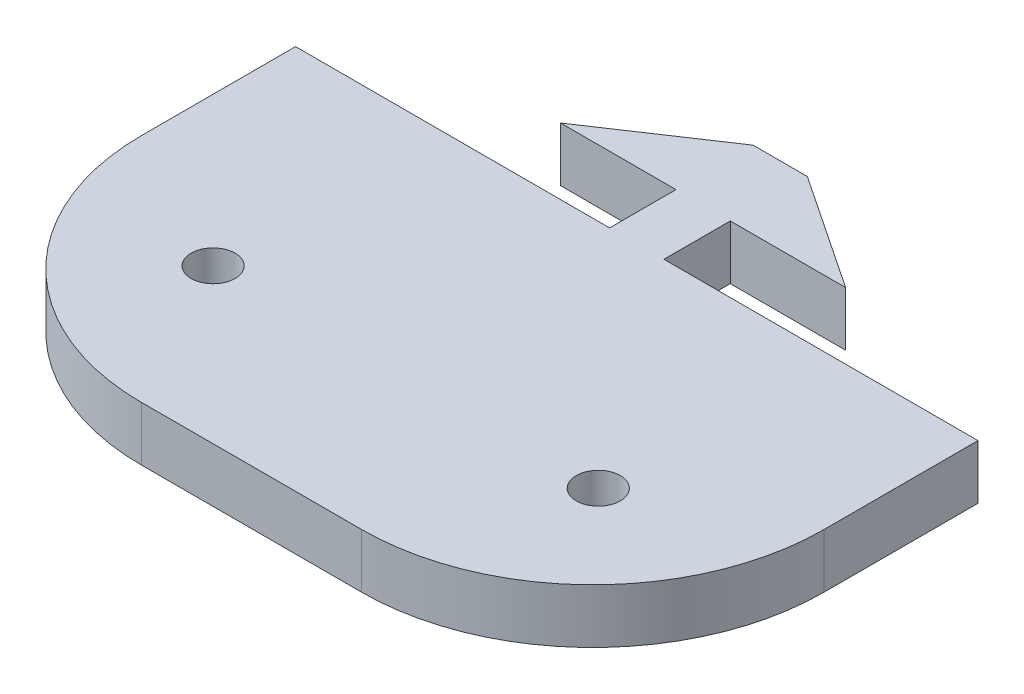
ISO-10303-21;
HEADER;
FILE_DESCRIPTION(('STEP AP214'),'2;1');
FILE_NAME('part.step','',(''),(''),'','','');
FILE_SCHEMA(('AUTOMOTIVE_DESIGN { 1 0 10303 214 1 1 1 1 }'));
ENDSEC;
DATA;
#1=APPLICATION_CONTEXT('core data for automotive mechanical design processes');
#2=APPLICATION_PROTOCOL_DEFINITION('international standard','automotive_design',2000,#1);
#3=PRODUCT_CONTEXT('',#1,'mechanical');
#4=PRODUCT('Part','Part','',(#3));
#5=PRODUCT_RELATED_PRODUCT_CATEGORY('part','',(#4));
#6=PRODUCT_DEFINITION_FORMATION('','',#4);
#7=PRODUCT_DEFINITION_CONTEXT('part definition',#1,'design');
#8=PRODUCT_DEFINITION('design','',#6,#7);
#9=PRODUCT_DEFINITION_SHAPE('','',#8);
#10=(LENGTH_UNIT() NAMED_UNIT(*) SI_UNIT(.MILLI.,.METRE.));
#11=(NAMED_UNIT(*) PLANE_ANGLE_UNIT() SI_UNIT($,.RADIAN.));
#12=(NAMED_UNIT(*) SI_UNIT($,.STERADIAN.) SOLID_ANGLE_UNIT());
#13=UNCERTAINTY_MEASURE_WITH_UNIT(LENGTH_MEASURE(1.E-05),#10,'distance_accuracy_value','');
#14=(GEOMETRIC_REPRESENTATION_CONTEXT(3) GLOBAL_UNCERTAINTY_ASSIGNED_CONTEXT((#13)) GLOBAL_UNIT_ASSIGNED_CONTEXT((#10,
#11,#12)) REPRESENTATION_CONTEXT('',''));
#15=CARTESIAN_POINT('',(0.,0.,0.));
#16=DIRECTION('',(0.,0.,1.));
#17=DIRECTION('',(1.,0.,0.));
#18=AXIS2_PLACEMENT_3D('',#15,#16,#17);
#19=CARTESIAN_POINT('',(0.,3.5814,27.5874988));
#20=DIRECTION('',(0.,0.,-1.));
#21=DIRECTION('',(-1.,0.,0.));
#22=AXIS2_PLACEMENT_3D('',#19,#20,#21);
#23=PLANE('',#22);
#24=DIRECTION('',(1.,0.,0.));
#25=VECTOR('',#24,1.);
#26=CARTESIAN_POINT('',(0.,3.5814,27.5874988));
#27=LINE('',#26,#25);
#28=CARTESIAN_POINT('',(-7.26,3.5814,27.5874988));
#29=VERTEX_POINT('',#28);
#30=CARTESIAN_POINT('',(7.26,3.5814,27.5874988));
#31=VERTEX_POINT('',#30);
#32=EDGE_CURVE('E144',#29,#31,#27,.T.);
#33=ORIENTED_EDGE('',*,*,#32,.F.);
#34=DIRECTION('',(0.,-1.,0.));
#35=VECTOR('',#34,1.);
#36=CARTESIAN_POINT('',(-7.26,3.5814,27.5874988));
#37=LINE('',#36,#35);
#38=CARTESIAN_POINT('',(-7.26,0.,27.5874988));
#39=VERTEX_POINT('',#38);
#40=EDGE_CURVE('E237',#29,#39,#37,.T.);
#41=ORIENTED_EDGE('',*,*,#40,.T.);
#42=DIRECTION('',(1.,0.,0.));
#43=VECTOR('',#42,1.);
#44=CARTESIAN_POINT('',(0.,0.,27.5874988));
#45=LINE('',#44,#43);
#46=CARTESIAN_POINT('',(7.26,0.,27.5874988));
#47=VERTEX_POINT('',#46);
#48=EDGE_CURVE('E187',#39,#47,#45,.T.);
#49=ORIENTED_EDGE('',*,*,#48,.T.);
#50=DIRECTION('',(0.,-1.,0.));
#51=VECTOR('',#50,1.);
#52=CARTESIAN_POINT('',(7.26,3.5814,27.5874988));
#53=LINE('',#52,#51);
#54=EDGE_CURVE('E154',#47,#31,#53,.F.);
#55=ORIENTED_EDGE('',*,*,#54,.T.);
#56=EDGE_LOOP('',(#33,#41,#49,#55));
#57=FACE_BOUND('',#56,.T.);
#58=ADVANCED_FACE('F35',(#57),#23,.F.);
#59=CARTESIAN_POINT('',(22.5,3.5814,0.));
#60=DIRECTION('',(-1.,0.,0.));
#61=DIRECTION('',(0.,0.,1.));
#62=AXIS2_PLACEMENT_3D('',#59,#60,#61);
#63=PLANE('',#62);
#64=DIRECTION('',(0.,0.,-1.));
#65=VECTOR('',#64,1.);
#66=CARTESIAN_POINT('',(22.5,3.5814,0.));
#67=LINE('',#66,#65);
#68=CARTESIAN_POINT('',(22.5,3.5814,12.3474988));
#69=VERTEX_POINT('',#68);
#70=CARTESIAN_POINT('',(22.5,3.5814,2.1874988));
#71=VERTEX_POINT('',#70);
#72=EDGE_CURVE('E137',#69,#71,#67,.T.);
#73=ORIENTED_EDGE('',*,*,#72,.F.);
#74=DIRECTION('',(0.,-1.,0.));
#75=VECTOR('',#74,1.);
#76=CARTESIAN_POINT('',(22.5,3.5814,12.3474988));
#77=LINE('',#76,#75);
#78=CARTESIAN_POINT('',(22.5,0.,12.3474988));
#79=VERTEX_POINT('',#78);
#80=EDGE_CURVE('E11',#69,#79,#77,.T.);
#81=ORIENTED_EDGE('',*,*,#80,.T.);
#82=DIRECTION('',(0.,0.,-1.));
#83=VECTOR('',#82,1.);
#84=CARTESIAN_POINT('',(22.5,0.,0.));
#85=LINE('',#84,#83);
#86=CARTESIAN_POINT('',(22.5,0.,2.1874988));
#87=VERTEX_POINT('',#86);
#88=EDGE_CURVE('E150',#79,#87,#85,.T.);
#89=ORIENTED_EDGE('',*,*,#88,.T.);
#90=DIRECTION('',(0.,-1.,0.));
#91=VECTOR('',#90,1.);
#92=CARTESIAN_POINT('',(22.5,3.5814,2.1874988));
#93=LINE('',#92,#91);
#94=EDGE_CURVE('E147',#71,#87,#93,.T.);
#95=ORIENTED_EDGE('',*,*,#94,.F.);
#96=EDGE_LOOP('',(#73,#81,#89,#95));
#97=FACE_BOUND('',#96,.T.);
#98=ADVANCED_FACE('F148',(#97),#63,.F.);
#99=CARTESIAN_POINT('',(0.,3.5814,2.1874988));
#100=DIRECTION('',(0.,0.,-1.));
#101=DIRECTION('',(-1.,0.,0.));
#102=AXIS2_PLACEMENT_3D('',#99,#100,#101);
#103=PLANE('',#102);
#104=DIRECTION('',(1.,0.,0.));
#105=VECTOR('',#104,1.);
#106=CARTESIAN_POINT('',(0.,0.,2.1874988));
#107=LINE('',#106,#105);
#108=CARTESIAN_POINT('',(1.7907,0.,2.1874988));
#109=VERTEX_POINT('',#108);
#110=EDGE_CURVE('E192',#109,#87,#107,.T.);
#111=ORIENTED_EDGE('',*,*,#110,.F.);
#112=DIRECTION('',(0.,-1.,0.));
#113=VECTOR('',#112,1.);
#114=CARTESIAN_POINT('',(1.7907,3.5814,2.1874988));
#115=LINE('',#114,#113);
#116=CARTESIAN_POINT('',(1.7907,3.5814,2.1874988));
#117=VERTEX_POINT('',#116);
#118=EDGE_CURVE('E155',#117,#109,#115,.T.);
#119=ORIENTED_EDGE('',*,*,#118,.F.);
#120=DIRECTION('',(1.,0.,0.));
#121=VECTOR('',#120,1.);
#122=CARTESIAN_POINT('',(0.,3.5814,2.1874988));
#123=LINE('',#122,#121);
#124=EDGE_CURVE('E141',#117,#71,#123,.T.);
#125=ORIENTED_EDGE('',*,*,#124,.T.);
#126=ORIENTED_EDGE('',*,*,#94,.T.);
#127=EDGE_LOOP('',(#111,#119,#125,#126));
#128=FACE_BOUND('',#127,.T.);
#129=ADVANCED_FACE('F157',(#128),#103,.T.);
#130=CARTESIAN_POINT('',(1.7907,3.5814,0.));
#131=DIRECTION('',(-1.,0.,0.));
#132=DIRECTION('',(0.,0.,1.));
#133=AXIS2_PLACEMENT_3D('',#130,#131,#132);
#134=PLANE('',#133);
#135=DIRECTION('',(0.,0.,-1.));
#136=VECTOR('',#135,1.);
#137=CARTESIAN_POINT('',(1.7907,0.,0.));
#138=LINE('',#137,#136);
#139=CARTESIAN_POINT('',(1.7907,0.,-2.1874988));
#140=VERTEX_POINT('',#139);
#141=EDGE_CURVE('E194',#109,#140,#138,.T.);
#142=ORIENTED_EDGE('',*,*,#141,.T.);
#143=DIRECTION('',(0.,-1.,0.));
#144=VECTOR('',#143,1.);
#145=CARTESIAN_POINT('',(1.7907,3.5814,-2.1874988));
#146=LINE('',#145,#144);
#147=CARTESIAN_POINT('',(1.7907,3.5814,-2.1874988));
#148=VERTEX_POINT('',#147);
#149=EDGE_CURVE('E233',#148,#140,#146,.T.);
#150=ORIENTED_EDGE('',*,*,#149,.F.);
#151=DIRECTION('',(0.,0.,-1.));
#152=VECTOR('',#151,1.);
#153=CARTESIAN_POINT('',(1.7907,3.5814,0.));
#154=LINE('',#153,#152);
#155=EDGE_CURVE('E159',#117,#148,#154,.T.);
#156=ORIENTED_EDGE('',*,*,#155,.F.);
#157=ORIENTED_EDGE('',*,*,#118,.T.);
#158=EDGE_LOOP('',(#142,#150,#156,#157));
#159=FACE_BOUND('',#158,.T.);
#160=ADVANCED_FACE('F289',(#159),#134,.F.);
#161=CARTESIAN_POINT('',(0.,3.5814,-2.1874988));
#162=DIRECTION('',(0.,0.,1.));
#163=DIRECTION('',(1.,0.,0.));
#164=AXIS2_PLACEMENT_3D('',#161,#162,#163);
#165=PLANE('',#164);
#166=DIRECTION('',(-1.,0.,0.));
#167=VECTOR('',#166,1.);
#168=CARTESIAN_POINT('',(0.,0.,-2.1874988));
#169=LINE('',#168,#167);
#170=CARTESIAN_POINT('',(9.398,0.,-2.1874988));
#171=VERTEX_POINT('',#170);
#172=EDGE_CURVE('E197',#171,#140,#169,.T.);
#173=ORIENTED_EDGE('',*,*,#172,.F.);
#174=DIRECTION('',(0.,-1.,0.));
#175=VECTOR('',#174,1.);
#176=CARTESIAN_POINT('',(9.398,3.5814,-2.1874988));
#177=LINE('',#176,#175);
#178=CARTESIAN_POINT('',(9.398,3.5814,-2.1874988));
#179=VERTEX_POINT('',#178);
#180=EDGE_CURVE('E231',#179,#171,#177,.T.);
#181=ORIENTED_EDGE('',*,*,#180,.F.);
#182=DIRECTION('',(-1.,0.,0.));
#183=VECTOR('',#182,1.);
#184=CARTESIAN_POINT('',(0.,3.5814,-2.1874988));
#185=LINE('',#184,#183);
#186=EDGE_CURVE('E161',#179,#148,#185,.T.);
#187=ORIENTED_EDGE('',*,*,#186,.T.);
#188=ORIENTED_EDGE('',*,*,#149,.T.);
#189=EDGE_LOOP('',(#173,#181,#187,#188));
#190=FACE_BOUND('',#189,.T.);
#191=ADVANCED_FACE('F285',(#190),#165,.T.);
#192=CARTESIAN_POINT('',(3.90863686168685,3.5814,-5.85318370037606));
#193=DIRECTION('',(0.55534080959066,0.,-0.831622862362014));
#194=DIRECTION('',(-0.831622862362014,0.,-0.55534080959066));
#195=AXIS2_PLACEMENT_3D('',#192,#193,#194);
#196=PLANE('',#195);
#197=DIRECTION('',(0.831622862362014,0.,0.55534080959066));
#198=VECTOR('',#197,1.);
#199=CARTESIAN_POINT('',(3.90863686168685,0.,-5.85318370037606));
#200=LINE('',#199,#198);
#201=CARTESIAN_POINT('',(1.7907,0.,-7.2674988));
#202=VERTEX_POINT('',#201);
#203=EDGE_CURVE('E200',#202,#171,#200,.T.);
#204=ORIENTED_EDGE('',*,*,#203,.F.);
#205=DIRECTION('',(0.,-1.,0.));
#206=VECTOR('',#205,1.);
#207=CARTESIAN_POINT('',(1.7907,3.5814,-7.2674988));
#208=LINE('',#207,#206);
#209=CARTESIAN_POINT('',(1.7907,3.5814,-7.2674988));
#210=VERTEX_POINT('',#209);
#211=EDGE_CURVE('E229',#210,#202,#208,.T.);
#212=ORIENTED_EDGE('',*,*,#211,.F.);
#213=DIRECTION('',(0.831622862362014,0.,0.55534080959066));
#214=VECTOR('',#213,1.);
#215=CARTESIAN_POINT('',(3.90863686168685,3.5814,-5.85318370037606));
#216=LINE('',#215,#214);
#217=EDGE_CURVE('E167',#210,#179,#216,.T.);
#218=ORIENTED_EDGE('',*,*,#217,.T.);
#219=ORIENTED_EDGE('',*,*,#180,.T.);
#220=EDGE_LOOP('',(#204,#212,#218,#219));
#221=FACE_BOUND('',#220,.T.);
#222=ADVANCED_FACE('F281',(#221),#196,.T.);
#223=CARTESIAN_POINT('',(0.,3.5814,-7.2674988));
#224=DIRECTION('',(0.,0.,-1.));
#225=DIRECTION('',(-1.,0.,0.));
#226=AXIS2_PLACEMENT_3D('',#223,#224,#225);
#227=PLANE('',#226);
#228=DIRECTION('',(1.,0.,0.));
#229=VECTOR('',#228,1.);
#230=CARTESIAN_POINT('',(0.,0.,-7.2674988));
#231=LINE('',#230,#229);
#232=CARTESIAN_POINT('',(-1.7907,0.,-7.2674988));
#233=VERTEX_POINT('',#232);
#234=EDGE_CURVE('E203',#233,#202,#231,.T.);
#235=ORIENTED_EDGE('',*,*,#234,.F.);
#236=DIRECTION('',(0.,-1.,0.));
#237=VECTOR('',#236,1.);
#238=CARTESIAN_POINT('',(-1.7907,3.5814,-7.2674988));
#239=LINE('',#238,#237);
#240=CARTESIAN_POINT('',(-1.7907,3.5814,-7.2674988));
#241=VERTEX_POINT('',#240);
#242=EDGE_CURVE('E227',#241,#233,#239,.T.);
#243=ORIENTED_EDGE('',*,*,#242,.F.);
#244=DIRECTION('',(1.,0.,0.));
#245=VECTOR('',#244,1.);
#246=CARTESIAN_POINT('',(0.,3.5814,-7.2674988));
#247=LINE('',#246,#245);
#248=EDGE_CURVE('E170',#241,#210,#247,.T.);
#249=ORIENTED_EDGE('',*,*,#248,.T.);
#250=ORIENTED_EDGE('',*,*,#211,.T.);
#251=EDGE_LOOP('',(#235,#243,#249,#250));
#252=FACE_BOUND('',#251,.T.);
#253=ADVANCED_FACE('F277',(#252),#227,.T.);
#254=CARTESIAN_POINT('',(-3.90863686168685,3.5814,-5.85318370037606));
#255=DIRECTION('',(-0.55534080959066,0.,-0.831622862362014));
#256=DIRECTION('',(-0.831622862362014,0.,0.55534080959066));
#257=AXIS2_PLACEMENT_3D('',#254,#255,#256);
#258=PLANE('',#257);
#259=DIRECTION('',(0.831622862362014,0.,-0.55534080959066));
#260=VECTOR('',#259,1.);
#261=CARTESIAN_POINT('',(-3.90863686168685,0.,-5.85318370037606));
#262=LINE('',#261,#260);
#263=CARTESIAN_POINT('',(-9.398,0.,-2.1874988));
#264=VERTEX_POINT('',#263);
#265=EDGE_CURVE('E206',#264,#233,#262,.T.);
#266=ORIENTED_EDGE('',*,*,#265,.F.);
#267=DIRECTION('',(0.,-1.,0.));
#268=VECTOR('',#267,1.);
#269=CARTESIAN_POINT('',(-9.398,3.5814,-2.1874988));
#270=LINE('',#269,#268);
#271=CARTESIAN_POINT('',(-9.398,3.5814,-2.1874988));
#272=VERTEX_POINT('',#271);
#273=EDGE_CURVE('E225',#272,#264,#270,.T.);
#274=ORIENTED_EDGE('',*,*,#273,.F.);
#275=DIRECTION('',(0.831622862362014,0.,-0.55534080959066));
#276=VECTOR('',#275,1.);
#277=CARTESIAN_POINT('',(-3.90863686168685,3.5814,-5.85318370037606));
#278=LINE('',#277,#276);
#279=EDGE_CURVE('E173',#272,#241,#278,.T.);
#280=ORIENTED_EDGE('',*,*,#279,.T.);
#281=ORIENTED_EDGE('',*,*,#242,.T.);
#282=EDGE_LOOP('',(#266,#274,#280,#281));
#283=FACE_BOUND('',#282,.T.);
#284=ADVANCED_FACE('F273',(#283),#258,.T.);
#285=CARTESIAN_POINT('',(0.,3.5814,-2.1874988));
#286=DIRECTION('',(0.,0.,1.));
#287=DIRECTION('',(1.,0.,0.));
#288=AXIS2_PLACEMENT_3D('',#285,#286,#287);
#289=PLANE('',#288);
#290=DIRECTION('',(-1.,0.,0.));
#291=VECTOR('',#290,1.);
#292=CARTESIAN_POINT('',(0.,0.,-2.1874988));
#293=LINE('',#292,#291);
#294=CARTESIAN_POINT('',(-1.7907,0.,-2.1874988));
#295=VERTEX_POINT('',#294);
#296=EDGE_CURVE('E209',#295,#264,#293,.T.);
#297=ORIENTED_EDGE('',*,*,#296,.F.);
#298=DIRECTION('',(0.,-1.,0.));
#299=VECTOR('',#298,1.);
#300=CARTESIAN_POINT('',(-1.7907,3.5814,-2.1874988));
#301=LINE('',#300,#299);
#302=CARTESIAN_POINT('',(-1.7907,3.5814,-2.1874988));
#303=VERTEX_POINT('',#302);
#304=EDGE_CURVE('E223',#303,#295,#301,.T.);
#305=ORIENTED_EDGE('',*,*,#304,.F.);
#306=DIRECTION('',(-1.,0.,0.));
#307=VECTOR('',#306,1.);
#308=CARTESIAN_POINT('',(0.,3.5814,-2.1874988));
#309=LINE('',#308,#307);
#310=EDGE_CURVE('E176',#303,#272,#309,.T.);
#311=ORIENTED_EDGE('',*,*,#310,.T.);
#312=ORIENTED_EDGE('',*,*,#273,.T.);
#313=EDGE_LOOP('',(#297,#305,#311,#312));
#314=FACE_BOUND('',#313,.T.);
#315=ADVANCED_FACE('F269',(#314),#289,.T.);
#316=CARTESIAN_POINT('',(-1.7907,3.5814,0.));
#317=DIRECTION('',(-1.,0.,0.));
#318=DIRECTION('',(0.,0.,1.));
#319=AXIS2_PLACEMENT_3D('',#316,#317,#318);
#320=PLANE('',#319);
#321=DIRECTION('',(0.,0.,-1.));
#322=VECTOR('',#321,1.);
#323=CARTESIAN_POINT('',(-1.7907,0.,0.));
#324=LINE('',#323,#322);
#325=CARTESIAN_POINT('',(-1.7907,0.,2.1874988));
#326=VERTEX_POINT('',#325);
#327=EDGE_CURVE('E212',#326,#295,#324,.T.);
#328=ORIENTED_EDGE('',*,*,#327,.F.);
#329=DIRECTION('',(0.,-1.,0.));
#330=VECTOR('',#329,1.);
#331=CARTESIAN_POINT('',(-1.7907,3.5814,2.1874988));
#332=LINE('',#331,#330);
#333=CARTESIAN_POINT('',(-1.7907,3.5814,2.1874988));
#334=VERTEX_POINT('',#333);
#335=EDGE_CURVE('E221',#334,#326,#332,.T.);
#336=ORIENTED_EDGE('',*,*,#335,.F.);
#337=DIRECTION('',(0.,0.,-1.));
#338=VECTOR('',#337,1.);
#339=CARTESIAN_POINT('',(-1.7907,3.5814,0.));
#340=LINE('',#339,#338);
#341=EDGE_CURVE('E179',#334,#303,#340,.T.);
#342=ORIENTED_EDGE('',*,*,#341,.T.);
#343=ORIENTED_EDGE('',*,*,#304,.T.);
#344=EDGE_LOOP('',(#328,#336,#342,#343));
#345=FACE_BOUND('',#344,.T.);
#346=ADVANCED_FACE('F265',(#345),#320,.T.);
#347=CARTESIAN_POINT('',(0.,3.5814,2.1874988));
#348=DIRECTION('',(0.,0.,1.));
#349=DIRECTION('',(1.,0.,0.));
#350=AXIS2_PLACEMENT_3D('',#347,#348,#349);
#351=PLANE('',#350);
#352=DIRECTION('',(-1.,0.,0.));
#353=VECTOR('',#352,1.);
#354=CARTESIAN_POINT('',(0.,0.,2.1874988));
#355=LINE('',#354,#353);
#356=CARTESIAN_POINT('',(-22.5,0.,2.1874988));
#357=VERTEX_POINT('',#356);
#358=EDGE_CURVE('E215',#326,#357,#355,.T.);
#359=ORIENTED_EDGE('',*,*,#358,.T.);
#360=DIRECTION('',(0.,-1.,0.));
#361=VECTOR('',#360,1.);
#362=CARTESIAN_POINT('',(-22.5,3.5814,2.1874988));
#363=LINE('',#362,#361);
#364=CARTESIAN_POINT('',(-22.5,3.5814,2.1874988));
#365=VERTEX_POINT('',#364);
#366=EDGE_CURVE('E186',#365,#357,#363,.T.);
#367=ORIENTED_EDGE('',*,*,#366,.F.);
#368=DIRECTION('',(-1.,0.,0.));
#369=VECTOR('',#368,1.);
#370=CARTESIAN_POINT('',(0.,3.5814,2.1874988));
#371=LINE('',#370,#369);
#372=EDGE_CURVE('E182',#334,#365,#371,.T.);
#373=ORIENTED_EDGE('',*,*,#372,.F.);
#374=ORIENTED_EDGE('',*,*,#335,.T.);
#375=EDGE_LOOP('',(#359,#367,#373,#374));
#376=FACE_BOUND('',#375,.T.);
#377=ADVANCED_FACE('F261',(#376),#351,.F.);
#378=CARTESIAN_POINT('',(-22.5,3.5814,0.));
#379=DIRECTION('',(1.,0.,0.));
#380=DIRECTION('',(0.,0.,-1.));
#381=AXIS2_PLACEMENT_3D('',#378,#379,#380);
#382=PLANE('',#381);
#383=DIRECTION('',(0.,0.,1.));
#384=VECTOR('',#383,1.);
#385=CARTESIAN_POINT('',(-22.5,0.,0.));
#386=LINE('',#385,#384);
#387=CARTESIAN_POINT('',(-22.5,0.,12.3474988));
#388=VERTEX_POINT('',#387);
#389=EDGE_CURVE('E217',#357,#388,#386,.T.);
#390=ORIENTED_EDGE('',*,*,#389,.T.);
#391=DIRECTION('',(0.,-1.,0.));
#392=VECTOR('',#391,1.);
#393=CARTESIAN_POINT('',(-22.5,3.5814,12.3474988));
#394=LINE('',#393,#392);
#395=CARTESIAN_POINT('',(-22.5,3.5814,12.3474988));
#396=VERTEX_POINT('',#395);
#397=EDGE_CURVE('E58',#388,#396,#394,.F.);
#398=ORIENTED_EDGE('',*,*,#397,.T.);
#399=DIRECTION('',(0.,0.,1.));
#400=VECTOR('',#399,1.);
#401=CARTESIAN_POINT('',(-22.5,3.5814,0.));
#402=LINE('',#401,#400);
#403=EDGE_CURVE('E184',#365,#396,#402,.T.);
#404=ORIENTED_EDGE('',*,*,#403,.F.);
#405=ORIENTED_EDGE('',*,*,#366,.T.);
#406=EDGE_LOOP('',(#390,#398,#404,#405));
#407=FACE_BOUND('',#406,.T.);
#408=ADVANCED_FACE('F257',(#407),#382,.F.);
#409=CARTESIAN_POINT('',(0.,3.5814,0.));
#410=DIRECTION('',(0.,1.,0.));
#411=DIRECTION('',(0.,0.,1.));
#412=AXIS2_PLACEMENT_3D('',#409,#410,#411);
#413=PLANE('',#412);
#414=CARTESIAN_POINT('',(-12.7,3.5814,17.4274988));
#415=DIRECTION('',(0.,1.,0.));
#416=DIRECTION('',(0.,0.,1.));
#417=AXIS2_PLACEMENT_3D('',#414,#415,#416);
#418=CIRCLE('',#417,1.45);
#419=CARTESIAN_POINT('',(-12.7,3.5814,18.8774988));
#420=VERTEX_POINT('',#419);
#421=EDGE_CURVE('E449',#420,#420,#418,.T.);
#422=ORIENTED_EDGE('',*,*,#421,.F.);
#423=EDGE_LOOP('',(#422));
#424=FACE_BOUND('',#423,.T.);
#425=CARTESIAN_POINT('',(12.7,3.5814,17.4274988));
#426=DIRECTION('',(0.,1.,0.));
#427=DIRECTION('',(0.,0.,1.));
#428=AXIS2_PLACEMENT_3D('',#425,#426,#427);
#429=CIRCLE('',#428,1.45);
#430=CARTESIAN_POINT('',(12.7,3.5814,18.8774988));
#431=VERTEX_POINT('',#430);
#432=EDGE_CURVE('E450',#431,#431,#429,.T.);
#433=ORIENTED_EDGE('',*,*,#432,.F.);
#434=EDGE_LOOP('',(#433));
#435=FACE_BOUND('',#434,.T.);
#436=ORIENTED_EDGE('',*,*,#403,.T.);
#437=CARTESIAN_POINT('',(-7.26,3.5814,12.3474988));
#438=DIRECTION('',(0.,1.,0.));
#439=DIRECTION('',(0.,0.,1.));
#440=AXIS2_PLACEMENT_3D('',#437,#438,#439);
#441=CIRCLE('',#440,15.24);
#442=EDGE_CURVE('E43',#396,#29,#441,.T.);
#443=ORIENTED_EDGE('',*,*,#442,.T.);
#444=ORIENTED_EDGE('',*,*,#32,.T.);
#445=CARTESIAN_POINT('',(7.26,3.5814,12.3474988));
#446=DIRECTION('',(0.,1.,0.));
#447=DIRECTION('',(0.,0.,1.));
#448=AXIS2_PLACEMENT_3D('',#445,#446,#447);
#449=CIRCLE('',#448,15.24);
#450=EDGE_CURVE('E50',#31,#69,#449,.T.);
#451=ORIENTED_EDGE('',*,*,#450,.T.);
#452=ORIENTED_EDGE('',*,*,#72,.T.);
#453=ORIENTED_EDGE('',*,*,#124,.F.);
#454=ORIENTED_EDGE('',*,*,#155,.T.);
#455=ORIENTED_EDGE('',*,*,#186,.F.);
#456=ORIENTED_EDGE('',*,*,#217,.F.);
#457=ORIENTED_EDGE('',*,*,#248,.F.);
#458=ORIENTED_EDGE('',*,*,#279,.F.);
#459=ORIENTED_EDGE('',*,*,#310,.F.);
#460=ORIENTED_EDGE('',*,*,#341,.F.);
#461=ORIENTED_EDGE('',*,*,#372,.T.);
#462=EDGE_LOOP('',(#436,#443,#444,#451,#452,#453,#454,#455,#456,#457,#458,#459,#460,#461));
#463=FACE_BOUND('',#462,.T.);
#464=ADVANCED_FACE('F139',(#424,#435,#463),#413,.T.);
#465=CARTESIAN_POINT('',(0.,0.,0.));
#466=DIRECTION('',(0.,1.,0.));
#467=DIRECTION('',(0.,0.,1.));
#468=AXIS2_PLACEMENT_3D('',#465,#466,#467);
#469=PLANE('',#468);
#470=CARTESIAN_POINT('',(-12.7,0.,17.4274988));
#471=DIRECTION('',(0.,1.,0.));
#472=DIRECTION('',(0.,0.,1.));
#473=AXIS2_PLACEMENT_3D('',#470,#471,#472);
#474=CIRCLE('',#473,1.45);
#475=CARTESIAN_POINT('',(-12.7,0.,18.8774988));
#476=VERTEX_POINT('',#475);
#477=EDGE_CURVE('E190',#476,#476,#474,.T.);
#478=ORIENTED_EDGE('',*,*,#477,.T.);
#479=EDGE_LOOP('',(#478));
#480=FACE_BOUND('',#479,.T.);
#481=CARTESIAN_POINT('',(12.7,0.,17.4274988));
#482=DIRECTION('',(0.,1.,0.));
#483=DIRECTION('',(0.,0.,1.));
#484=AXIS2_PLACEMENT_3D('',#481,#482,#483);
#485=CIRCLE('',#484,1.45);
#486=CARTESIAN_POINT('',(12.7,0.,18.8774988));
#487=VERTEX_POINT('',#486);
#488=EDGE_CURVE('E448',#487,#487,#485,.T.);
#489=ORIENTED_EDGE('',*,*,#488,.T.);
#490=EDGE_LOOP('',(#489));
#491=FACE_BOUND('',#490,.T.);
#492=ORIENTED_EDGE('',*,*,#48,.F.);
#493=CARTESIAN_POINT('',(-7.26,0.,12.3474988));
#494=DIRECTION('',(0.,1.,0.));
#495=DIRECTION('',(0.,0.,1.));
#496=AXIS2_PLACEMENT_3D('',#493,#494,#495);
#497=CIRCLE('',#496,15.24);
#498=EDGE_CURVE('E242',#39,#388,#497,.F.);
#499=ORIENTED_EDGE('',*,*,#498,.T.);
#500=ORIENTED_EDGE('',*,*,#389,.F.);
#501=ORIENTED_EDGE('',*,*,#358,.F.);
#502=ORIENTED_EDGE('',*,*,#327,.T.);
#503=ORIENTED_EDGE('',*,*,#296,.T.);
#504=ORIENTED_EDGE('',*,*,#265,.T.);
#505=ORIENTED_EDGE('',*,*,#234,.T.);
#506=ORIENTED_EDGE('',*,*,#203,.T.);
#507=ORIENTED_EDGE('',*,*,#172,.T.);
#508=ORIENTED_EDGE('',*,*,#141,.F.);
#509=ORIENTED_EDGE('',*,*,#110,.T.);
#510=ORIENTED_EDGE('',*,*,#88,.F.);
#511=CARTESIAN_POINT('',(7.26,0.,12.3474988));
#512=DIRECTION('',(0.,1.,0.));
#513=DIRECTION('',(0.,0.,1.));
#514=AXIS2_PLACEMENT_3D('',#511,#512,#513);
#515=CIRCLE('',#514,15.24);
#516=EDGE_CURVE('E240',#79,#47,#515,.F.);
#517=ORIENTED_EDGE('',*,*,#516,.T.);
#518=EDGE_LOOP('',(#492,#499,#500,#501,#502,#503,#504,#505,#506,#507,#508,#509,#510,#517));
#519=FACE_BOUND('',#518,.T.);
#520=ADVANCED_FACE('F255',(#480,#491,#519),#469,.F.);
#521=CARTESIAN_POINT('',(12.7,0.,17.4274988));
#522=DIRECTION('',(0.,1.,0.));
#523=DIRECTION('',(0.,0.,1.));
#524=AXIS2_PLACEMENT_3D('',#521,#522,#523);
#525=CYLINDRICAL_SURFACE('',#524,1.45);
#526=ORIENTED_EDGE('',*,*,#488,.F.);
#527=EDGE_LOOP('',(#526));
#528=FACE_BOUND('',#527,.T.);
#529=ORIENTED_EDGE('',*,*,#432,.T.);
#530=EDGE_LOOP('',(#529));
#531=FACE_BOUND('',#530,.T.);
#532=ADVANCED_FACE('F311',(#528,#531),#525,.F.);
#533=CARTESIAN_POINT('',(-12.7,0.,17.4274988));
#534=DIRECTION('',(0.,1.,0.));
#535=DIRECTION('',(0.,0.,1.));
#536=AXIS2_PLACEMENT_3D('',#533,#534,#535);
#537=CYLINDRICAL_SURFACE('',#536,1.45);
#538=ORIENTED_EDGE('',*,*,#477,.F.);
#539=EDGE_LOOP('',(#538));
#540=FACE_BOUND('',#539,.T.);
#541=ORIENTED_EDGE('',*,*,#421,.T.);
#542=EDGE_LOOP('',(#541));
#543=FACE_BOUND('',#542,.T.);
#544=ADVANCED_FACE('F305',(#540,#543),#537,.F.);
#545=CARTESIAN_POINT('',(-7.26,3.5814,12.3474988));
#546=DIRECTION('',(0.,-1.,0.));
#547=DIRECTION('',(0.,0.,-1.));
#548=AXIS2_PLACEMENT_3D('',#545,#546,#547);
#549=CYLINDRICAL_SURFACE('',#548,15.24);
#550=ORIENTED_EDGE('',*,*,#442,.F.);
#551=ORIENTED_EDGE('',*,*,#397,.F.);
#552=ORIENTED_EDGE('',*,*,#498,.F.);
#553=ORIENTED_EDGE('',*,*,#40,.F.);
#554=EDGE_LOOP('',(#550,#551,#552,#553));
#555=FACE_BOUND('',#554,.T.);
#556=ADVANCED_FACE('F252',(#555),#549,.T.);
#557=CARTESIAN_POINT('',(7.26,3.5814,12.3474988));
#558=DIRECTION('',(0.,-1.,0.));
#559=DIRECTION('',(0.,0.,-1.));
#560=AXIS2_PLACEMENT_3D('',#557,#558,#559);
#561=CYLINDRICAL_SURFACE('',#560,15.24);
#562=ORIENTED_EDGE('',*,*,#450,.F.);
#563=ORIENTED_EDGE('',*,*,#54,.F.);
#564=ORIENTED_EDGE('',*,*,#516,.F.);
#565=ORIENTED_EDGE('',*,*,#80,.F.);
#566=EDGE_LOOP('',(#562,#563,#564,#565));
#567=FACE_BOUND('',#566,.T.);
#568=ADVANCED_FACE('F37',(#567),#561,.T.);
#569=CLOSED_SHELL('',(#58,#98,#129,#160,#191,#222,#253,#284,#315,#346,#377,#408,#464,#520,#532,
#544,#556,#568));
#570=MANIFOLD_SOLID_BREP('B2',#569);
#571=ADVANCED_BREP_SHAPE_REPRESENTATION('',(#18,#570),#14);
#572=SHAPE_DEFINITION_REPRESENTATION(#9,#571);
ENDSEC;
END-ISO-10303-21;
